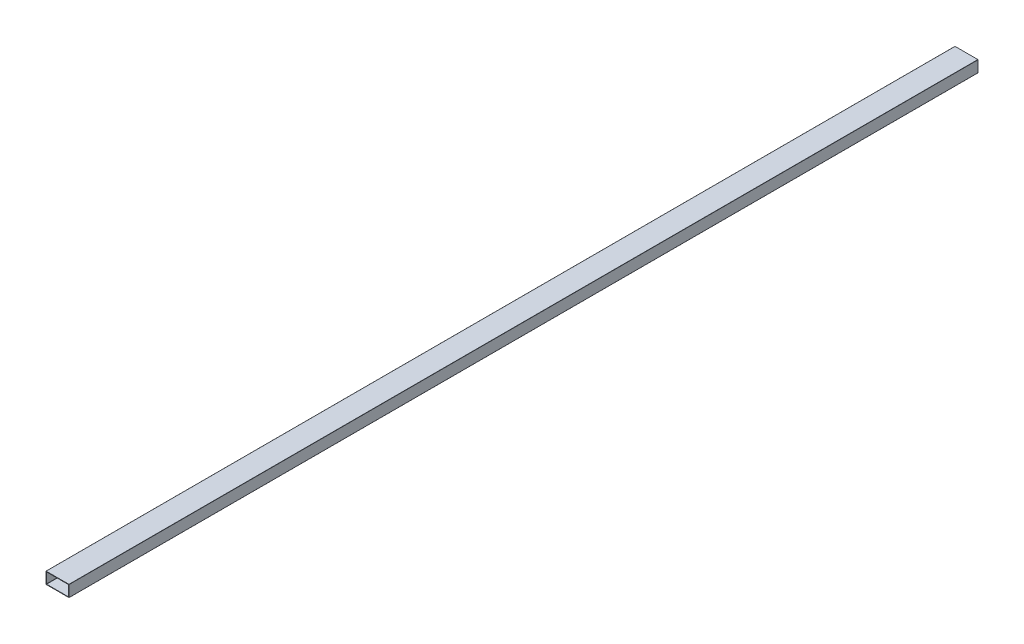
ISO-10303-21;
HEADER;
FILE_DESCRIPTION(('STEP AP214'),'2;1');
FILE_NAME('part.step','',(''),(''),'','','');
FILE_SCHEMA(('AUTOMOTIVE_DESIGN { 1 0 10303 214 1 1 1 1 }'));
ENDSEC;
DATA;
#1=APPLICATION_CONTEXT('core data for automotive mechanical design processes');
#2=APPLICATION_PROTOCOL_DEFINITION('international standard','automotive_design',2000,#1);
#3=PRODUCT_CONTEXT('',#1,'mechanical');
#4=PRODUCT('Part','Part','',(#3));
#5=PRODUCT_RELATED_PRODUCT_CATEGORY('part','',(#4));
#6=PRODUCT_DEFINITION_FORMATION('','',#4);
#7=PRODUCT_DEFINITION_CONTEXT('part definition',#1,'design');
#8=PRODUCT_DEFINITION('design','',#6,#7);
#9=PRODUCT_DEFINITION_SHAPE('','',#8);
#10=(LENGTH_UNIT() NAMED_UNIT(*) SI_UNIT(.MILLI.,.METRE.));
#11=(NAMED_UNIT(*) PLANE_ANGLE_UNIT() SI_UNIT($,.RADIAN.));
#12=(NAMED_UNIT(*) SI_UNIT($,.STERADIAN.) SOLID_ANGLE_UNIT());
#13=UNCERTAINTY_MEASURE_WITH_UNIT(LENGTH_MEASURE(1.E-05),#10,'distance_accuracy_value','');
#14=(GEOMETRIC_REPRESENTATION_CONTEXT(3) GLOBAL_UNCERTAINTY_ASSIGNED_CONTEXT((#13)) GLOBAL_UNIT_ASSIGNED_CONTEXT((#10,
#11,#12)) REPRESENTATION_CONTEXT('',''));
#15=CARTESIAN_POINT('',(0.,0.,0.));
#16=DIRECTION('',(0.,0.,1.));
#17=DIRECTION('',(1.,0.,0.));
#18=AXIS2_PLACEMENT_3D('',#15,#16,#17);
#19=CARTESIAN_POINT('',(76.2,-38.1,-6000.));
#20=DIRECTION('',(1.,0.,0.));
#21=DIRECTION('',(0.,0.,-1.));
#22=AXIS2_PLACEMENT_3D('',#19,#20,#21);
#23=PLANE('',#22);
#24=DIRECTION('',(0.,1.,0.));
#25=VECTOR('',#24,1.);
#26=CARTESIAN_POINT('',(76.2,-38.1,0.));
#27=LINE('',#26,#25);
#28=CARTESIAN_POINT('',(76.2,-37.1,0.));
#29=VERTEX_POINT('',#28);
#30=CARTESIAN_POINT('',(76.2,37.1,0.));
#31=VERTEX_POINT('',#30);
#32=EDGE_CURVE('E197',#29,#31,#27,.T.);
#33=ORIENTED_EDGE('',*,*,#32,.F.);
#34=DIRECTION('',(0.,0.,1.));
#35=VECTOR('',#34,1.);
#36=CARTESIAN_POINT('',(76.2,-37.1,-6000.));
#37=LINE('',#36,#35);
#38=CARTESIAN_POINT('',(76.2,-37.1,-6000.));
#39=VERTEX_POINT('',#38);
#40=EDGE_CURVE('E158',#29,#39,#37,.F.);
#41=ORIENTED_EDGE('',*,*,#40,.T.);
#42=DIRECTION('',(0.,1.,0.));
#43=VECTOR('',#42,1.);
#44=CARTESIAN_POINT('',(76.2,-38.1,-6000.));
#45=LINE('',#44,#43);
#46=CARTESIAN_POINT('',(76.2,37.1,-6000.));
#47=VERTEX_POINT('',#46);
#48=EDGE_CURVE('E185',#39,#47,#45,.T.);
#49=ORIENTED_EDGE('',*,*,#48,.T.);
#50=DIRECTION('',(0.,0.,1.));
#51=VECTOR('',#50,1.);
#52=CARTESIAN_POINT('',(76.2,37.1,-6000.));
#53=LINE('',#52,#51);
#54=EDGE_CURVE('E251',#47,#31,#53,.T.);
#55=ORIENTED_EDGE('',*,*,#54,.T.);
#56=EDGE_LOOP('',(#33,#41,#49,#55));
#57=FACE_BOUND('',#56,.T.);
#58=ADVANCED_FACE('F33',(#57),#23,.T.);
#59=CARTESIAN_POINT('',(-76.2,-38.1,-6000.));
#60=DIRECTION('',(0.,-1.,0.));
#61=DIRECTION('',(0.,0.,-1.));
#62=AXIS2_PLACEMENT_3D('',#59,#60,#61);
#63=PLANE('',#62);
#64=DIRECTION('',(1.,0.,0.));
#65=VECTOR('',#64,1.);
#66=CARTESIAN_POINT('',(-76.2,-38.1,0.));
#67=LINE('',#66,#65);
#68=CARTESIAN_POINT('',(-75.2,-38.1,0.));
#69=VERTEX_POINT('',#68);
#70=CARTESIAN_POINT('',(75.1999999999999,-38.1,0.));
#71=VERTEX_POINT('',#70);
#72=EDGE_CURVE('E189',#69,#71,#67,.T.);
#73=ORIENTED_EDGE('',*,*,#72,.F.);
#74=DIRECTION('',(0.,0.,1.));
#75=VECTOR('',#74,1.);
#76=CARTESIAN_POINT('',(-75.2,-38.1,-6000.));
#77=LINE('',#76,#75);
#78=CARTESIAN_POINT('',(-75.2,-38.1,-6000.));
#79=VERTEX_POINT('',#78);
#80=EDGE_CURVE('E238',#69,#79,#77,.F.);
#81=ORIENTED_EDGE('',*,*,#80,.T.);
#82=DIRECTION('',(1.,0.,0.));
#83=VECTOR('',#82,1.);
#84=CARTESIAN_POINT('',(-76.2,-38.1,-6000.));
#85=LINE('',#84,#83);
#86=CARTESIAN_POINT('',(75.1999999999999,-38.1,-6000.));
#87=VERTEX_POINT('',#86);
#88=EDGE_CURVE('E194',#79,#87,#85,.T.);
#89=ORIENTED_EDGE('',*,*,#88,.T.);
#90=DIRECTION('',(0.,0.,1.));
#91=VECTOR('',#90,1.);
#92=CARTESIAN_POINT('',(75.2,-38.1,-6000.));
#93=LINE('',#92,#91);
#94=EDGE_CURVE('E235',#87,#71,#93,.T.);
#95=ORIENTED_EDGE('',*,*,#94,.T.);
#96=EDGE_LOOP('',(#73,#81,#89,#95));
#97=FACE_BOUND('',#96,.T.);
#98=ADVANCED_FACE('F305',(#97),#63,.T.);
#99=CARTESIAN_POINT('',(-76.2,-38.1,-6000.));
#100=DIRECTION('',(-1.,0.,0.));
#101=DIRECTION('',(0.,0.,1.));
#102=AXIS2_PLACEMENT_3D('',#99,#100,#101);
#103=PLANE('',#102);
#104=DIRECTION('',(0.,-1.,0.));
#105=VECTOR('',#104,1.);
#106=CARTESIAN_POINT('',(-76.2,-38.1,-6000.));
#107=LINE('',#106,#105);
#108=CARTESIAN_POINT('',(-76.2,37.1,-6000.));
#109=VERTEX_POINT('',#108);
#110=CARTESIAN_POINT('',(-76.2,-37.1,-6000.));
#111=VERTEX_POINT('',#110);
#112=EDGE_CURVE('E191',#109,#111,#107,.T.);
#113=ORIENTED_EDGE('',*,*,#112,.T.);
#114=DIRECTION('',(0.,0.,1.));
#115=VECTOR('',#114,1.);
#116=CARTESIAN_POINT('',(-76.2,-37.1,-6000.));
#117=LINE('',#116,#115);
#118=CARTESIAN_POINT('',(-76.2,-37.1,0.));
#119=VERTEX_POINT('',#118);
#120=EDGE_CURVE('E224',#111,#119,#117,.T.);
#121=ORIENTED_EDGE('',*,*,#120,.T.);
#122=DIRECTION('',(0.,-1.,0.));
#123=VECTOR('',#122,1.);
#124=CARTESIAN_POINT('',(-76.2,-38.1,0.));
#125=LINE('',#124,#123);
#126=CARTESIAN_POINT('',(-76.2,37.1,0.));
#127=VERTEX_POINT('',#126);
#128=EDGE_CURVE('E203',#127,#119,#125,.T.);
#129=ORIENTED_EDGE('',*,*,#128,.F.);
#130=DIRECTION('',(0.,0.,1.));
#131=VECTOR('',#130,1.);
#132=CARTESIAN_POINT('',(-76.2,37.1,-6000.));
#133=LINE('',#132,#131);
#134=EDGE_CURVE('E222',#127,#109,#133,.F.);
#135=ORIENTED_EDGE('',*,*,#134,.T.);
#136=EDGE_LOOP('',(#113,#121,#129,#135));
#137=FACE_BOUND('',#136,.T.);
#138=ADVANCED_FACE('F311',(#137),#103,.T.);
#139=CARTESIAN_POINT('',(-76.2,38.1,-6000.));
#140=DIRECTION('',(0.,1.,0.));
#141=DIRECTION('',(0.,0.,1.));
#142=AXIS2_PLACEMENT_3D('',#139,#140,#141);
#143=PLANE('',#142);
#144=DIRECTION('',(-1.,0.,0.));
#145=VECTOR('',#144,1.);
#146=CARTESIAN_POINT('',(-76.2,38.1,-6000.));
#147=LINE('',#146,#145);
#148=CARTESIAN_POINT('',(75.1999999999999,38.1,-6000.));
#149=VERTEX_POINT('',#148);
#150=CARTESIAN_POINT('',(-75.2,38.1,-6000.));
#151=VERTEX_POINT('',#150);
#152=EDGE_CURVE('E188',#149,#151,#147,.T.);
#153=ORIENTED_EDGE('',*,*,#152,.T.);
#154=DIRECTION('',(0.,0.,1.));
#155=VECTOR('',#154,1.);
#156=CARTESIAN_POINT('',(-75.2,38.1,-6000.));
#157=LINE('',#156,#155);
#158=CARTESIAN_POINT('',(-75.2,38.1,0.));
#159=VERTEX_POINT('',#158);
#160=EDGE_CURVE('E248',#151,#159,#157,.T.);
#161=ORIENTED_EDGE('',*,*,#160,.T.);
#162=DIRECTION('',(-1.,0.,0.));
#163=VECTOR('',#162,1.);
#164=CARTESIAN_POINT('',(-76.2,38.1,0.));
#165=LINE('',#164,#163);
#166=CARTESIAN_POINT('',(75.1999999999999,38.1,0.));
#167=VERTEX_POINT('',#166);
#168=EDGE_CURVE('E200',#167,#159,#165,.T.);
#169=ORIENTED_EDGE('',*,*,#168,.F.);
#170=DIRECTION('',(0.,0.,1.));
#171=VECTOR('',#170,1.);
#172=CARTESIAN_POINT('',(75.2,38.1,-6000.));
#173=LINE('',#172,#171);
#174=EDGE_CURVE('E55',#167,#149,#173,.F.);
#175=ORIENTED_EDGE('',*,*,#174,.T.);
#176=EDGE_LOOP('',(#153,#161,#169,#175));
#177=FACE_BOUND('',#176,.T.);
#178=ADVANCED_FACE('F316',(#177),#143,.T.);
#179=CARTESIAN_POINT('',(0.,0.,-6000.));
#180=DIRECTION('',(0.,0.,-1.));
#181=DIRECTION('',(-1.,0.,0.));
#182=AXIS2_PLACEMENT_3D('',#179,#180,#181);
#183=PLANE('',#182);
#184=DIRECTION('',(0.,-1.,0.));
#185=VECTOR('',#184,1.);
#186=CARTESIAN_POINT('',(-73.16,-35.06,-6000.));
#187=LINE('',#186,#185);
#188=CARTESIAN_POINT('',(-73.16,34.06,-6000.));
#189=VERTEX_POINT('',#188);
#190=CARTESIAN_POINT('',(-73.16,-34.06,-6000.));
#191=VERTEX_POINT('',#190);
#192=EDGE_CURVE('E167',#189,#191,#187,.T.);
#193=ORIENTED_EDGE('',*,*,#192,.T.);
#194=CARTESIAN_POINT('',(-72.16,-34.06,-6000.));
#195=DIRECTION('',(0.,0.,-1.));
#196=DIRECTION('',(-1.,0.,0.));
#197=AXIS2_PLACEMENT_3D('',#194,#195,#196);
#198=CIRCLE('',#197,1.);
#199=CARTESIAN_POINT('',(-72.16,-35.06,-6000.));
#200=VERTEX_POINT('',#199);
#201=EDGE_CURVE('E11',#191,#200,#198,.F.);
#202=ORIENTED_EDGE('',*,*,#201,.T.);
#203=DIRECTION('',(1.,0.,0.));
#204=VECTOR('',#203,1.);
#205=CARTESIAN_POINT('',(-73.16,-35.06,-6000.));
#206=LINE('',#205,#204);
#207=CARTESIAN_POINT('',(72.16,-35.06,-6000.));
#208=VERTEX_POINT('',#207);
#209=EDGE_CURVE('E175',#200,#208,#206,.T.);
#210=ORIENTED_EDGE('',*,*,#209,.T.);
#211=CARTESIAN_POINT('',(72.16,-34.06,-6000.));
#212=DIRECTION('',(0.,0.,-1.));
#213=DIRECTION('',(-1.,0.,0.));
#214=AXIS2_PLACEMENT_3D('',#211,#212,#213);
#215=CIRCLE('',#214,1.);
#216=CARTESIAN_POINT('',(73.16,-34.06,-6000.));
#217=VERTEX_POINT('',#216);
#218=EDGE_CURVE('E262',#208,#217,#215,.F.);
#219=ORIENTED_EDGE('',*,*,#218,.T.);
#220=DIRECTION('',(0.,1.,0.));
#221=VECTOR('',#220,1.);
#222=CARTESIAN_POINT('',(73.16,-35.06,-6000.));
#223=LINE('',#222,#221);
#224=CARTESIAN_POINT('',(73.16,34.06,-6000.));
#225=VERTEX_POINT('',#224);
#226=EDGE_CURVE('E179',#217,#225,#223,.T.);
#227=ORIENTED_EDGE('',*,*,#226,.T.);
#228=CARTESIAN_POINT('',(72.16,34.06,-6000.));
#229=DIRECTION('',(0.,0.,-1.));
#230=DIRECTION('',(-1.,0.,0.));
#231=AXIS2_PLACEMENT_3D('',#228,#229,#230);
#232=CIRCLE('',#231,1.);
#233=CARTESIAN_POINT('',(72.16,35.06,-6000.));
#234=VERTEX_POINT('',#233);
#235=EDGE_CURVE('E258',#225,#234,#232,.F.);
#236=ORIENTED_EDGE('',*,*,#235,.T.);
#237=DIRECTION('',(-1.,0.,0.));
#238=VECTOR('',#237,1.);
#239=CARTESIAN_POINT('',(-73.16,35.06,-6000.));
#240=LINE('',#239,#238);
#241=CARTESIAN_POINT('',(-72.16,35.06,-6000.));
#242=VERTEX_POINT('',#241);
#243=EDGE_CURVE('E277',#234,#242,#240,.T.);
#244=ORIENTED_EDGE('',*,*,#243,.T.);
#245=CARTESIAN_POINT('',(-72.16,34.06,-6000.));
#246=DIRECTION('',(0.,0.,-1.));
#247=DIRECTION('',(-1.,0.,0.));
#248=AXIS2_PLACEMENT_3D('',#245,#246,#247);
#249=CIRCLE('',#248,1.);
#250=EDGE_CURVE('E157',#242,#189,#249,.F.);
#251=ORIENTED_EDGE('',*,*,#250,.T.);
#252=EDGE_LOOP('',(#193,#202,#210,#219,#227,#236,#244,#251));
#253=FACE_BOUND('',#252,.T.);
#254=ORIENTED_EDGE('',*,*,#88,.F.);
#255=CARTESIAN_POINT('',(-75.2,-37.1,-6000.));
#256=DIRECTION('',(0.,0.,-1.));
#257=DIRECTION('',(-1.,0.,0.));
#258=AXIS2_PLACEMENT_3D('',#255,#256,#257);
#259=CIRCLE('',#258,1.);
#260=EDGE_CURVE('E245',#79,#111,#259,.T.);
#261=ORIENTED_EDGE('',*,*,#260,.T.);
#262=ORIENTED_EDGE('',*,*,#112,.F.);
#263=CARTESIAN_POINT('',(-75.2,37.1,-6000.));
#264=DIRECTION('',(0.,0.,-1.));
#265=DIRECTION('',(-1.,0.,0.));
#266=AXIS2_PLACEMENT_3D('',#263,#264,#265);
#267=CIRCLE('',#266,1.);
#268=EDGE_CURVE('E48',#109,#151,#267,.T.);
#269=ORIENTED_EDGE('',*,*,#268,.T.);
#270=ORIENTED_EDGE('',*,*,#152,.F.);
#271=CARTESIAN_POINT('',(75.2,37.1,-6000.));
#272=DIRECTION('',(0.,0.,-1.));
#273=DIRECTION('',(-1.,0.,0.));
#274=AXIS2_PLACEMENT_3D('',#271,#272,#273);
#275=CIRCLE('',#274,1.);
#276=EDGE_CURVE('E240',#149,#47,#275,.T.);
#277=ORIENTED_EDGE('',*,*,#276,.T.);
#278=ORIENTED_EDGE('',*,*,#48,.F.);
#279=CARTESIAN_POINT('',(75.2,-37.1,-6000.));
#280=DIRECTION('',(0.,0.,-1.));
#281=DIRECTION('',(-1.,0.,0.));
#282=AXIS2_PLACEMENT_3D('',#279,#280,#281);
#283=CIRCLE('',#282,1.);
#284=EDGE_CURVE('E242',#39,#87,#283,.T.);
#285=ORIENTED_EDGE('',*,*,#284,.T.);
#286=EDGE_LOOP('',(#254,#261,#262,#269,#270,#277,#278,#285));
#287=FACE_BOUND('',#286,.T.);
#288=ADVANCED_FACE('F267',(#253,#287),#183,.T.);
#289=CARTESIAN_POINT('',(0.,0.,0.));
#290=DIRECTION('',(0.,0.,-1.));
#291=DIRECTION('',(-1.,0.,0.));
#292=AXIS2_PLACEMENT_3D('',#289,#290,#291);
#293=PLANE('',#292);
#294=DIRECTION('',(0.,1.,0.));
#295=VECTOR('',#294,1.);
#296=CARTESIAN_POINT('',(73.16,-35.06,0.));
#297=LINE('',#296,#295);
#298=CARTESIAN_POINT('',(73.16,-34.06,0.));
#299=VERTEX_POINT('',#298);
#300=CARTESIAN_POINT('',(73.16,34.06,0.));
#301=VERTEX_POINT('',#300);
#302=EDGE_CURVE('E181',#299,#301,#297,.T.);
#303=ORIENTED_EDGE('',*,*,#302,.F.);
#304=CARTESIAN_POINT('',(72.16,-34.06,0.));
#305=DIRECTION('',(0.,0.,-1.));
#306=DIRECTION('',(-1.,0.,0.));
#307=AXIS2_PLACEMENT_3D('',#304,#305,#306);
#308=CIRCLE('',#307,1.);
#309=CARTESIAN_POINT('',(72.16,-35.06,0.));
#310=VERTEX_POINT('',#309);
#311=EDGE_CURVE('E260',#299,#310,#308,.T.);
#312=ORIENTED_EDGE('',*,*,#311,.T.);
#313=DIRECTION('',(1.,0.,0.));
#314=VECTOR('',#313,1.);
#315=CARTESIAN_POINT('',(-73.16,-35.06,0.));
#316=LINE('',#315,#314);
#317=CARTESIAN_POINT('',(-72.16,-35.06,0.));
#318=VERTEX_POINT('',#317);
#319=EDGE_CURVE('E281',#318,#310,#316,.T.);
#320=ORIENTED_EDGE('',*,*,#319,.F.);
#321=CARTESIAN_POINT('',(-72.16,-34.06,0.));
#322=DIRECTION('',(0.,0.,-1.));
#323=DIRECTION('',(-1.,0.,0.));
#324=AXIS2_PLACEMENT_3D('',#321,#322,#323);
#325=CIRCLE('',#324,1.);
#326=CARTESIAN_POINT('',(-73.16,-34.06,0.));
#327=VERTEX_POINT('',#326);
#328=EDGE_CURVE('E41',#318,#327,#325,.T.);
#329=ORIENTED_EDGE('',*,*,#328,.T.);
#330=DIRECTION('',(0.,-1.,0.));
#331=VECTOR('',#330,1.);
#332=CARTESIAN_POINT('',(-73.16,-35.06,0.));
#333=LINE('',#332,#331);
#334=CARTESIAN_POINT('',(-73.16,34.06,0.));
#335=VERTEX_POINT('',#334);
#336=EDGE_CURVE('E164',#335,#327,#333,.T.);
#337=ORIENTED_EDGE('',*,*,#336,.F.);
#338=CARTESIAN_POINT('',(-72.16,34.06,0.));
#339=DIRECTION('',(0.,0.,-1.));
#340=DIRECTION('',(-1.,0.,0.));
#341=AXIS2_PLACEMENT_3D('',#338,#339,#340);
#342=CIRCLE('',#341,1.);
#343=CARTESIAN_POINT('',(-72.16,35.06,0.));
#344=VERTEX_POINT('',#343);
#345=EDGE_CURVE('E147',#335,#344,#342,.T.);
#346=ORIENTED_EDGE('',*,*,#345,.T.);
#347=DIRECTION('',(-1.,0.,0.));
#348=VECTOR('',#347,1.);
#349=CARTESIAN_POINT('',(-73.16,35.06,0.));
#350=LINE('',#349,#348);
#351=CARTESIAN_POINT('',(72.16,35.06,0.));
#352=VERTEX_POINT('',#351);
#353=EDGE_CURVE('E176',#352,#344,#350,.T.);
#354=ORIENTED_EDGE('',*,*,#353,.F.);
#355=CARTESIAN_POINT('',(72.16,34.06,0.));
#356=DIRECTION('',(0.,0.,-1.));
#357=DIRECTION('',(-1.,0.,0.));
#358=AXIS2_PLACEMENT_3D('',#355,#356,#357);
#359=CIRCLE('',#358,1.);
#360=EDGE_CURVE('E256',#352,#301,#359,.T.);
#361=ORIENTED_EDGE('',*,*,#360,.T.);
#362=EDGE_LOOP('',(#303,#312,#320,#329,#337,#346,#354,#361));
#363=FACE_BOUND('',#362,.T.);
#364=ORIENTED_EDGE('',*,*,#128,.T.);
#365=CARTESIAN_POINT('',(-75.2,-37.1,0.));
#366=DIRECTION('',(0.,0.,-1.));
#367=DIRECTION('',(-1.,0.,0.));
#368=AXIS2_PLACEMENT_3D('',#365,#366,#367);
#369=CIRCLE('',#368,1.);
#370=EDGE_CURVE('E233',#119,#69,#369,.F.);
#371=ORIENTED_EDGE('',*,*,#370,.T.);
#372=ORIENTED_EDGE('',*,*,#72,.T.);
#373=CARTESIAN_POINT('',(75.2,-37.1,0.));
#374=DIRECTION('',(0.,0.,-1.));
#375=DIRECTION('',(-1.,0.,0.));
#376=AXIS2_PLACEMENT_3D('',#373,#374,#375);
#377=CIRCLE('',#376,1.);
#378=EDGE_CURVE('E229',#71,#29,#377,.F.);
#379=ORIENTED_EDGE('',*,*,#378,.T.);
#380=ORIENTED_EDGE('',*,*,#32,.T.);
#381=CARTESIAN_POINT('',(75.2,37.1,0.));
#382=DIRECTION('',(0.,0.,-1.));
#383=DIRECTION('',(-1.,0.,0.));
#384=AXIS2_PLACEMENT_3D('',#381,#382,#383);
#385=CIRCLE('',#384,1.);
#386=EDGE_CURVE('E227',#31,#167,#385,.F.);
#387=ORIENTED_EDGE('',*,*,#386,.T.);
#388=ORIENTED_EDGE('',*,*,#168,.T.);
#389=CARTESIAN_POINT('',(-75.2,37.1,0.));
#390=DIRECTION('',(0.,0.,-1.));
#391=DIRECTION('',(-1.,0.,0.));
#392=AXIS2_PLACEMENT_3D('',#389,#390,#391);
#393=CIRCLE('',#392,1.);
#394=EDGE_CURVE('E231',#159,#127,#393,.F.);
#395=ORIENTED_EDGE('',*,*,#394,.T.);
#396=EDGE_LOOP('',(#364,#371,#372,#379,#380,#387,#388,#395));
#397=FACE_BOUND('',#396,.T.);
#398=ADVANCED_FACE('F172',(#363,#397),#293,.F.);
#399=CARTESIAN_POINT('',(-73.16,-35.06,-6000.));
#400=DIRECTION('',(0.,-1.,0.));
#401=DIRECTION('',(0.,0.,-1.));
#402=AXIS2_PLACEMENT_3D('',#399,#400,#401);
#403=PLANE('',#402);
#404=ORIENTED_EDGE('',*,*,#319,.T.);
#405=DIRECTION('',(0.,0.,1.));
#406=VECTOR('',#405,1.);
#407=CARTESIAN_POINT('',(72.16,-35.06,-6000.));
#408=LINE('',#407,#406);
#409=EDGE_CURVE('E220',#310,#208,#408,.F.);
#410=ORIENTED_EDGE('',*,*,#409,.T.);
#411=ORIENTED_EDGE('',*,*,#209,.F.);
#412=DIRECTION('',(0.,0.,1.));
#413=VECTOR('',#412,1.);
#414=CARTESIAN_POINT('',(-72.16,-35.06,0.));
#415=LINE('',#414,#413);
#416=EDGE_CURVE('E217',#200,#318,#415,.T.);
#417=ORIENTED_EDGE('',*,*,#416,.T.);
#418=EDGE_LOOP('',(#404,#410,#411,#417));
#419=FACE_BOUND('',#418,.T.);
#420=ADVANCED_FACE('F283',(#419),#403,.F.);
#421=CARTESIAN_POINT('',(-73.16,-35.06,-6000.));
#422=DIRECTION('',(-1.,0.,0.));
#423=DIRECTION('',(0.,0.,1.));
#424=AXIS2_PLACEMENT_3D('',#421,#422,#423);
#425=PLANE('',#424);
#426=ORIENTED_EDGE('',*,*,#192,.F.);
#427=DIRECTION('',(0.,0.,1.));
#428=VECTOR('',#427,1.);
#429=CARTESIAN_POINT('',(-73.16,34.06,0.));
#430=LINE('',#429,#428);
#431=EDGE_CURVE('E151',#189,#335,#430,.T.);
#432=ORIENTED_EDGE('',*,*,#431,.T.);
#433=ORIENTED_EDGE('',*,*,#336,.T.);
#434=DIRECTION('',(0.,0.,1.));
#435=VECTOR('',#434,1.);
#436=CARTESIAN_POINT('',(-73.16,-34.06,-6000.));
#437=LINE('',#436,#435);
#438=EDGE_CURVE('E169',#327,#191,#437,.F.);
#439=ORIENTED_EDGE('',*,*,#438,.T.);
#440=EDGE_LOOP('',(#426,#432,#433,#439));
#441=FACE_BOUND('',#440,.T.);
#442=ADVANCED_FACE('F163',(#441),#425,.F.);
#443=CARTESIAN_POINT('',(-73.16,35.06,-6000.));
#444=DIRECTION('',(0.,1.,0.));
#445=DIRECTION('',(0.,0.,1.));
#446=AXIS2_PLACEMENT_3D('',#443,#444,#445);
#447=PLANE('',#446);
#448=ORIENTED_EDGE('',*,*,#353,.T.);
#449=DIRECTION('',(0.,0.,1.));
#450=VECTOR('',#449,1.);
#451=CARTESIAN_POINT('',(-72.16,35.06,-6000.));
#452=LINE('',#451,#450);
#453=EDGE_CURVE('E152',#344,#242,#452,.F.);
#454=ORIENTED_EDGE('',*,*,#453,.T.);
#455=ORIENTED_EDGE('',*,*,#243,.F.);
#456=DIRECTION('',(0.,0.,1.));
#457=VECTOR('',#456,1.);
#458=CARTESIAN_POINT('',(72.16,35.06,0.));
#459=LINE('',#458,#457);
#460=EDGE_CURVE('E168',#234,#352,#459,.T.);
#461=ORIENTED_EDGE('',*,*,#460,.T.);
#462=EDGE_LOOP('',(#448,#454,#455,#461));
#463=FACE_BOUND('',#462,.T.);
#464=ADVANCED_FACE('F292',(#463),#447,.F.);
#465=CARTESIAN_POINT('',(73.16,-35.06,-6000.));
#466=DIRECTION('',(1.,0.,0.));
#467=DIRECTION('',(0.,1.,0.));
#468=AXIS2_PLACEMENT_3D('',#465,#466,#467);
#469=PLANE('',#468);
#470=ORIENTED_EDGE('',*,*,#302,.T.);
#471=DIRECTION('',(0.,0.,1.));
#472=VECTOR('',#471,1.);
#473=CARTESIAN_POINT('',(73.16,34.06,-6000.));
#474=LINE('',#473,#472);
#475=EDGE_CURVE('E215',#301,#225,#474,.F.);
#476=ORIENTED_EDGE('',*,*,#475,.T.);
#477=ORIENTED_EDGE('',*,*,#226,.F.);
#478=DIRECTION('',(0.,0.,1.));
#479=VECTOR('',#478,1.);
#480=CARTESIAN_POINT('',(73.16,-34.06,0.));
#481=LINE('',#480,#479);
#482=EDGE_CURVE('E212',#217,#299,#481,.T.);
#483=ORIENTED_EDGE('',*,*,#482,.T.);
#484=EDGE_LOOP('',(#470,#476,#477,#483));
#485=FACE_BOUND('',#484,.T.);
#486=ADVANCED_FACE('F275',(#485),#469,.F.);
#487=CARTESIAN_POINT('',(-72.16,34.06,-6000.));
#488=DIRECTION('',(0.,0.,-1.));
#489=DIRECTION('',(-1.,0.,0.));
#490=AXIS2_PLACEMENT_3D('',#487,#488,#489);
#491=CYLINDRICAL_SURFACE('',#490,1.);
#492=ORIENTED_EDGE('',*,*,#250,.F.);
#493=ORIENTED_EDGE('',*,*,#453,.F.);
#494=ORIENTED_EDGE('',*,*,#345,.F.);
#495=ORIENTED_EDGE('',*,*,#431,.F.);
#496=EDGE_LOOP('',(#492,#493,#494,#495));
#497=FACE_BOUND('',#496,.T.);
#498=ADVANCED_FACE('F150',(#497),#491,.F.);
#499=CARTESIAN_POINT('',(72.16,34.06,-6000.));
#500=DIRECTION('',(0.,0.,-1.));
#501=DIRECTION('',(-1.,0.,0.));
#502=AXIS2_PLACEMENT_3D('',#499,#500,#501);
#503=CYLINDRICAL_SURFACE('',#502,1.);
#504=ORIENTED_EDGE('',*,*,#235,.F.);
#505=ORIENTED_EDGE('',*,*,#475,.F.);
#506=ORIENTED_EDGE('',*,*,#360,.F.);
#507=ORIENTED_EDGE('',*,*,#460,.F.);
#508=EDGE_LOOP('',(#504,#505,#506,#507));
#509=FACE_BOUND('',#508,.T.);
#510=ADVANCED_FACE('F294',(#509),#503,.F.);
#511=CARTESIAN_POINT('',(72.16,-34.06,-6000.));
#512=DIRECTION('',(0.,0.,-1.));
#513=DIRECTION('',(-1.,0.,0.));
#514=AXIS2_PLACEMENT_3D('',#511,#512,#513);
#515=CYLINDRICAL_SURFACE('',#514,1.);
#516=ORIENTED_EDGE('',*,*,#218,.F.);
#517=ORIENTED_EDGE('',*,*,#409,.F.);
#518=ORIENTED_EDGE('',*,*,#311,.F.);
#519=ORIENTED_EDGE('',*,*,#482,.F.);
#520=EDGE_LOOP('',(#516,#517,#518,#519));
#521=FACE_BOUND('',#520,.T.);
#522=ADVANCED_FACE('F279',(#521),#515,.F.);
#523=CARTESIAN_POINT('',(-75.2,-37.1,-6000.));
#524=DIRECTION('',(0.,0.,1.));
#525=DIRECTION('',(1.,0.,0.));
#526=AXIS2_PLACEMENT_3D('',#523,#524,#525);
#527=CYLINDRICAL_SURFACE('',#526,1.);
#528=ORIENTED_EDGE('',*,*,#260,.F.);
#529=ORIENTED_EDGE('',*,*,#80,.F.);
#530=ORIENTED_EDGE('',*,*,#370,.F.);
#531=ORIENTED_EDGE('',*,*,#120,.F.);
#532=EDGE_LOOP('',(#528,#529,#530,#531));
#533=FACE_BOUND('',#532,.T.);
#534=ADVANCED_FACE('F301',(#533),#527,.T.);
#535=CARTESIAN_POINT('',(-75.2,37.1,-6000.));
#536=DIRECTION('',(0.,0.,1.));
#537=DIRECTION('',(1.,0.,0.));
#538=AXIS2_PLACEMENT_3D('',#535,#536,#537);
#539=CYLINDRICAL_SURFACE('',#538,1.);
#540=ORIENTED_EDGE('',*,*,#268,.F.);
#541=ORIENTED_EDGE('',*,*,#134,.F.);
#542=ORIENTED_EDGE('',*,*,#394,.F.);
#543=ORIENTED_EDGE('',*,*,#160,.F.);
#544=EDGE_LOOP('',(#540,#541,#542,#543));
#545=FACE_BOUND('',#544,.T.);
#546=ADVANCED_FACE('F368',(#545),#539,.T.);
#547=CARTESIAN_POINT('',(-72.16,-34.06,-6000.));
#548=DIRECTION('',(0.,0.,-1.));
#549=DIRECTION('',(-1.,0.,0.));
#550=AXIS2_PLACEMENT_3D('',#547,#548,#549);
#551=CYLINDRICAL_SURFACE('',#550,1.);
#552=ORIENTED_EDGE('',*,*,#201,.F.);
#553=ORIENTED_EDGE('',*,*,#438,.F.);
#554=ORIENTED_EDGE('',*,*,#328,.F.);
#555=ORIENTED_EDGE('',*,*,#416,.F.);
#556=EDGE_LOOP('',(#552,#553,#554,#555));
#557=FACE_BOUND('',#556,.T.);
#558=ADVANCED_FACE('F378',(#557),#551,.F.);
#559=CARTESIAN_POINT('',(75.2,-37.1,-6000.));
#560=DIRECTION('',(0.,0.,1.));
#561=DIRECTION('',(1.,0.,0.));
#562=AXIS2_PLACEMENT_3D('',#559,#560,#561);
#563=CYLINDRICAL_SURFACE('',#562,1.);
#564=ORIENTED_EDGE('',*,*,#284,.F.);
#565=ORIENTED_EDGE('',*,*,#40,.F.);
#566=ORIENTED_EDGE('',*,*,#378,.F.);
#567=ORIENTED_EDGE('',*,*,#94,.F.);
#568=EDGE_LOOP('',(#564,#565,#566,#567));
#569=FACE_BOUND('',#568,.T.);
#570=ADVANCED_FACE('F388',(#569),#563,.T.);
#571=CARTESIAN_POINT('',(75.2,37.1,-6000.));
#572=DIRECTION('',(0.,0.,1.));
#573=DIRECTION('',(1.,0.,0.));
#574=AXIS2_PLACEMENT_3D('',#571,#572,#573);
#575=CYLINDRICAL_SURFACE('',#574,1.);
#576=ORIENTED_EDGE('',*,*,#276,.F.);
#577=ORIENTED_EDGE('',*,*,#174,.F.);
#578=ORIENTED_EDGE('',*,*,#386,.F.);
#579=ORIENTED_EDGE('',*,*,#54,.F.);
#580=EDGE_LOOP('',(#576,#577,#578,#579));
#581=FACE_BOUND('',#580,.T.);
#582=ADVANCED_FACE('F35',(#581),#575,.T.);
#583=CLOSED_SHELL('',(#58,#98,#138,#178,#288,#398,#420,#442,#464,#486,#498,#510,#522,#534,#546,
#558,#570,#582));
#584=MANIFOLD_SOLID_BREP('B2',#583);
#585=ADVANCED_BREP_SHAPE_REPRESENTATION('',(#18,#584),#14);
#586=SHAPE_DEFINITION_REPRESENTATION(#9,#585);
ENDSEC;
END-ISO-10303-21;
